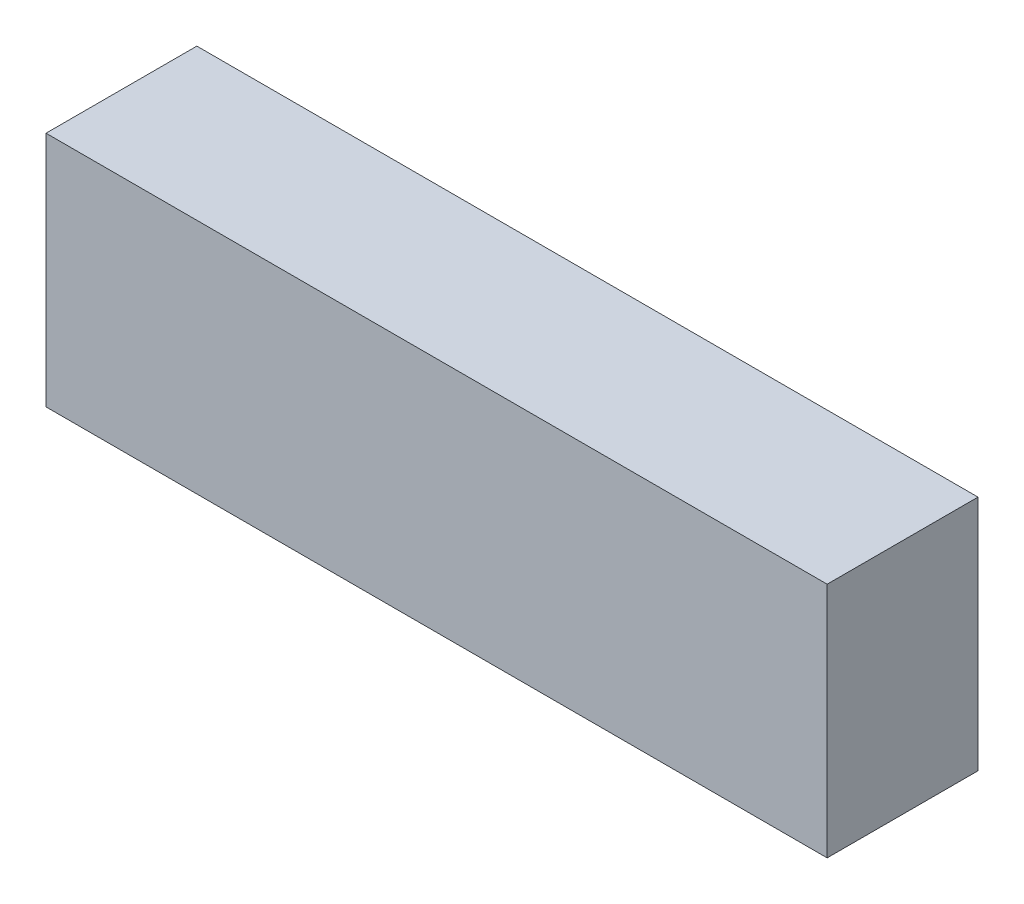
ISO-10303-21;
HEADER;
FILE_DESCRIPTION(('STEP AP214'),'2;1');
FILE_NAME('part.step','',(''),(''),'','','');
FILE_SCHEMA(('AUTOMOTIVE_DESIGN { 1 0 10303 214 1 1 1 1 }'));
ENDSEC;
DATA;
#1=APPLICATION_CONTEXT('core data for automotive mechanical design processes');
#2=APPLICATION_PROTOCOL_DEFINITION('international standard','automotive_design',2000,#1);
#3=PRODUCT_CONTEXT('',#1,'mechanical');
#4=PRODUCT('Part','Part','',(#3));
#5=PRODUCT_RELATED_PRODUCT_CATEGORY('part','',(#4));
#6=PRODUCT_DEFINITION_FORMATION('','',#4);
#7=PRODUCT_DEFINITION_CONTEXT('part definition',#1,'design');
#8=PRODUCT_DEFINITION('design','',#6,#7);
#9=PRODUCT_DEFINITION_SHAPE('','',#8);
#10=(LENGTH_UNIT() NAMED_UNIT(*) SI_UNIT(.MILLI.,.METRE.));
#11=(NAMED_UNIT(*) PLANE_ANGLE_UNIT() SI_UNIT($,.RADIAN.));
#12=(NAMED_UNIT(*) SI_UNIT($,.STERADIAN.) SOLID_ANGLE_UNIT());
#13=UNCERTAINTY_MEASURE_WITH_UNIT(LENGTH_MEASURE(1.E-05),#10,'distance_accuracy_value','');
#14=(GEOMETRIC_REPRESENTATION_CONTEXT(3) GLOBAL_UNCERTAINTY_ASSIGNED_CONTEXT((#13)) GLOBAL_UNIT_ASSIGNED_CONTEXT((#10,
#11,#12)) REPRESENTATION_CONTEXT('',''));
#15=CARTESIAN_POINT('',(0.,0.,0.));
#16=DIRECTION('',(0.,0.,1.));
#17=DIRECTION('',(1.,0.,0.));
#18=AXIS2_PLACEMENT_3D('',#15,#16,#17);
#19=CARTESIAN_POINT('',(-72.5,-22.,28.));
#20=DIRECTION('',(1.,0.,0.));
#21=DIRECTION('',(0.,0.,-1.));
#22=AXIS2_PLACEMENT_3D('',#19,#20,#21);
#23=PLANE('',#22);
#24=DIRECTION('',(0.,-1.,0.));
#25=VECTOR('',#24,1.);
#26=CARTESIAN_POINT('',(-72.5,-22.,0.));
#27=LINE('',#26,#25);
#28=CARTESIAN_POINT('',(-72.5,22.,0.));
#29=VERTEX_POINT('',#28);
#30=CARTESIAN_POINT('',(-72.5,-22.,0.));
#31=VERTEX_POINT('',#30);
#32=EDGE_CURVE('E101',#29,#31,#27,.T.);
#33=ORIENTED_EDGE('',*,*,#32,.T.);
#34=DIRECTION('',(0.,0.,-1.));
#35=VECTOR('',#34,1.);
#36=CARTESIAN_POINT('',(-72.5,-22.,28.));
#37=LINE('',#36,#35);
#38=CARTESIAN_POINT('',(-72.5,-22.,28.));
#39=VERTEX_POINT('',#38);
#40=EDGE_CURVE('E11',#39,#31,#37,.T.);
#41=ORIENTED_EDGE('',*,*,#40,.F.);
#42=DIRECTION('',(0.,-1.,0.));
#43=VECTOR('',#42,1.);
#44=CARTESIAN_POINT('',(-72.5,-22.,28.));
#45=LINE('',#44,#43);
#46=CARTESIAN_POINT('',(-72.5,22.,28.));
#47=VERTEX_POINT('',#46);
#48=EDGE_CURVE('E89',#47,#39,#45,.T.);
#49=ORIENTED_EDGE('',*,*,#48,.F.);
#50=DIRECTION('',(0.,0.,-1.));
#51=VECTOR('',#50,1.);
#52=CARTESIAN_POINT('',(-72.5,22.,28.));
#53=LINE('',#52,#51);
#54=EDGE_CURVE('E97',#47,#29,#53,.T.);
#55=ORIENTED_EDGE('',*,*,#54,.T.);
#56=EDGE_LOOP('',(#33,#41,#49,#55));
#57=FACE_BOUND('',#56,.T.);
#58=ADVANCED_FACE('F38',(#57),#23,.F.);
#59=CARTESIAN_POINT('',(72.5,-22.,28.));
#60=DIRECTION('',(0.,1.,0.));
#61=DIRECTION('',(-1.,0.,0.));
#62=AXIS2_PLACEMENT_3D('',#59,#60,#61);
#63=PLANE('',#62);
#64=DIRECTION('',(1.,0.,0.));
#65=VECTOR('',#64,1.);
#66=CARTESIAN_POINT('',(72.5,-22.,0.));
#67=LINE('',#66,#65);
#68=CARTESIAN_POINT('',(72.5,-22.,0.));
#69=VERTEX_POINT('',#68);
#70=EDGE_CURVE('E93',#31,#69,#67,.T.);
#71=ORIENTED_EDGE('',*,*,#70,.T.);
#72=DIRECTION('',(0.,0.,-1.));
#73=VECTOR('',#72,1.);
#74=CARTESIAN_POINT('',(72.5,-22.,28.));
#75=LINE('',#74,#73);
#76=CARTESIAN_POINT('',(72.5,-22.,28.));
#77=VERTEX_POINT('',#76);
#78=EDGE_CURVE('E46',#77,#69,#75,.T.);
#79=ORIENTED_EDGE('',*,*,#78,.F.);
#80=DIRECTION('',(1.,0.,0.));
#81=VECTOR('',#80,1.);
#82=CARTESIAN_POINT('',(72.5,-22.,28.));
#83=LINE('',#82,#81);
#84=EDGE_CURVE('E84',#39,#77,#83,.T.);
#85=ORIENTED_EDGE('',*,*,#84,.F.);
#86=ORIENTED_EDGE('',*,*,#40,.T.);
#87=EDGE_LOOP('',(#71,#79,#85,#86));
#88=FACE_BOUND('',#87,.T.);
#89=ADVANCED_FACE('F92',(#88),#63,.F.);
#90=CARTESIAN_POINT('',(72.5,-22.,28.));
#91=DIRECTION('',(-1.,0.,0.));
#92=DIRECTION('',(0.,0.,1.));
#93=AXIS2_PLACEMENT_3D('',#90,#91,#92);
#94=PLANE('',#93);
#95=DIRECTION('',(0.,1.,0.));
#96=VECTOR('',#95,1.);
#97=CARTESIAN_POINT('',(72.5,-22.,0.));
#98=LINE('',#97,#96);
#99=CARTESIAN_POINT('',(72.5,22.,0.));
#100=VERTEX_POINT('',#99);
#101=EDGE_CURVE('E71',#69,#100,#98,.T.);
#102=ORIENTED_EDGE('',*,*,#101,.T.);
#103=DIRECTION('',(0.,0.,-1.));
#104=VECTOR('',#103,1.);
#105=CARTESIAN_POINT('',(72.5,22.,28.));
#106=LINE('',#105,#104);
#107=CARTESIAN_POINT('',(72.5,22.,28.));
#108=VERTEX_POINT('',#107);
#109=EDGE_CURVE('E94',#108,#100,#106,.T.);
#110=ORIENTED_EDGE('',*,*,#109,.F.);
#111=DIRECTION('',(0.,1.,0.));
#112=VECTOR('',#111,1.);
#113=CARTESIAN_POINT('',(72.5,-22.,28.));
#114=LINE('',#113,#112);
#115=EDGE_CURVE('E87',#77,#108,#114,.T.);
#116=ORIENTED_EDGE('',*,*,#115,.F.);
#117=ORIENTED_EDGE('',*,*,#78,.T.);
#118=EDGE_LOOP('',(#102,#110,#116,#117));
#119=FACE_BOUND('',#118,.T.);
#120=ADVANCED_FACE('F95',(#119),#94,.F.);
#121=CARTESIAN_POINT('',(72.5,22.,28.));
#122=DIRECTION('',(0.,-1.,0.));
#123=DIRECTION('',(1.,0.,0.));
#124=AXIS2_PLACEMENT_3D('',#121,#122,#123);
#125=PLANE('',#124);
#126=DIRECTION('',(-1.,0.,0.));
#127=VECTOR('',#126,1.);
#128=CARTESIAN_POINT('',(72.5,22.,0.));
#129=LINE('',#128,#127);
#130=EDGE_CURVE('E77',#100,#29,#129,.T.);
#131=ORIENTED_EDGE('',*,*,#130,.T.);
#132=ORIENTED_EDGE('',*,*,#54,.F.);
#133=DIRECTION('',(-1.,0.,0.));
#134=VECTOR('',#133,1.);
#135=CARTESIAN_POINT('',(72.5,22.,28.));
#136=LINE('',#135,#134);
#137=EDGE_CURVE('E54',#108,#47,#136,.T.);
#138=ORIENTED_EDGE('',*,*,#137,.F.);
#139=ORIENTED_EDGE('',*,*,#109,.T.);
#140=EDGE_LOOP('',(#131,#132,#138,#139));
#141=FACE_BOUND('',#140,.T.);
#142=ADVANCED_FACE('F108',(#141),#125,.F.);
#143=CARTESIAN_POINT('',(0.,0.,28.));
#144=DIRECTION('',(0.,0.,1.));
#145=DIRECTION('',(1.,0.,0.));
#146=AXIS2_PLACEMENT_3D('',#143,#144,#145);
#147=PLANE('',#146);
#148=ORIENTED_EDGE('',*,*,#48,.T.);
#149=ORIENTED_EDGE('',*,*,#84,.T.);
#150=ORIENTED_EDGE('',*,*,#115,.T.);
#151=ORIENTED_EDGE('',*,*,#137,.T.);
#152=EDGE_LOOP('',(#148,#149,#150,#151));
#153=FACE_BOUND('',#152,.T.);
#154=ADVANCED_FACE('F85',(#153),#147,.T.);
#155=CARTESIAN_POINT('',(0.,0.,0.));
#156=DIRECTION('',(0.,0.,1.));
#157=DIRECTION('',(1.,0.,0.));
#158=AXIS2_PLACEMENT_3D('',#155,#156,#157);
#159=PLANE('',#158);
#160=ORIENTED_EDGE('',*,*,#32,.F.);
#161=ORIENTED_EDGE('',*,*,#130,.F.);
#162=ORIENTED_EDGE('',*,*,#101,.F.);
#163=ORIENTED_EDGE('',*,*,#70,.F.);
#164=EDGE_LOOP('',(#160,#161,#162,#163));
#165=FACE_BOUND('',#164,.T.);
#166=ADVANCED_FACE('F111',(#165),#159,.F.);
#167=CLOSED_SHELL('',(#58,#89,#120,#142,#154,#166));
#168=MANIFOLD_SOLID_BREP('B2',#167);
#169=ADVANCED_BREP_SHAPE_REPRESENTATION('',(#18,#168),#14);
#170=SHAPE_DEFINITION_REPRESENTATION(#9,#169);
ENDSEC;
END-ISO-10303-21;
